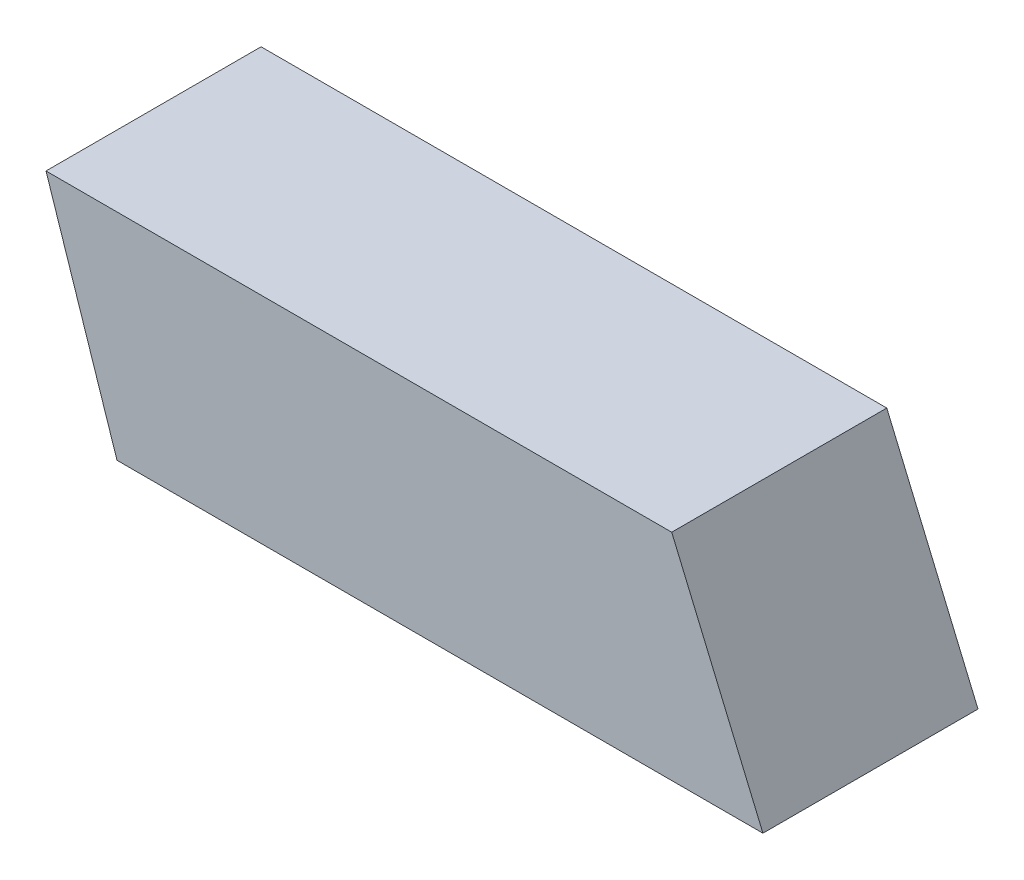
ISO-10303-21;
HEADER;
FILE_DESCRIPTION(('STEP AP214'),'2;1');
FILE_NAME('part.step','',(''),(''),'','','');
FILE_SCHEMA(('AUTOMOTIVE_DESIGN { 1 0 10303 214 1 1 1 1 }'));
ENDSEC;
DATA;
#1=APPLICATION_CONTEXT('core data for automotive mechanical design processes');
#2=APPLICATION_PROTOCOL_DEFINITION('international standard','automotive_design',2000,#1);
#3=PRODUCT_CONTEXT('',#1,'mechanical');
#4=PRODUCT('Part','Part','',(#3));
#5=PRODUCT_RELATED_PRODUCT_CATEGORY('part','',(#4));
#6=PRODUCT_DEFINITION_FORMATION('','',#4);
#7=PRODUCT_DEFINITION_CONTEXT('part definition',#1,'design');
#8=PRODUCT_DEFINITION('design','',#6,#7);
#9=PRODUCT_DEFINITION_SHAPE('','',#8);
#10=(LENGTH_UNIT() NAMED_UNIT(*) SI_UNIT(.MILLI.,.METRE.));
#11=(NAMED_UNIT(*) PLANE_ANGLE_UNIT() SI_UNIT($,.RADIAN.));
#12=(NAMED_UNIT(*) SI_UNIT($,.STERADIAN.) SOLID_ANGLE_UNIT());
#13=UNCERTAINTY_MEASURE_WITH_UNIT(LENGTH_MEASURE(1.E-05),#10,'distance_accuracy_value','');
#14=(GEOMETRIC_REPRESENTATION_CONTEXT(3) GLOBAL_UNCERTAINTY_ASSIGNED_CONTEXT((#13)) GLOBAL_UNIT_ASSIGNED_CONTEXT((#10,
#11,#12)) REPRESENTATION_CONTEXT('',''));
#15=CARTESIAN_POINT('',(0.,0.,0.));
#16=DIRECTION('',(0.,0.,1.));
#17=DIRECTION('',(1.,0.,0.));
#18=AXIS2_PLACEMENT_3D('',#15,#16,#17);
#19=CARTESIAN_POINT('',(20.,3.,-3.));
#20=DIRECTION('',(0.,0.,1.));
#21=DIRECTION('',(0.,-1.,0.));
#22=AXIS2_PLACEMENT_3D('',#19,#20,#21);
#23=PLANE('',#22);
#24=DIRECTION('',(-1.,0.,0.));
#25=VECTOR('',#24,1.);
#26=CARTESIAN_POINT('',(20.,-3.,-3.));
#27=LINE('',#26,#25);
#28=CARTESIAN_POINT('',(20.,-3.,-3.));
#29=VERTEX_POINT('',#28);
#30=CARTESIAN_POINT('',(1.98077745183307,-3.,-3.));
#31=VERTEX_POINT('',#30);
#32=EDGE_CURVE('E94',#29,#31,#27,.T.);
#33=ORIENTED_EDGE('',*,*,#32,.T.);
#34=DIRECTION('',(-0.313488412184445,0.949592025780585,0.));
#35=VECTOR('',#34,1.);
#36=CARTESIAN_POINT('',(1.96549969147849,-2.95372192769933,-3.));
#37=LINE('',#36,#35);
#38=CARTESIAN_POINT('',(0.,3.,-3.));
#39=VERTEX_POINT('',#38);
#40=EDGE_CURVE('E78',#31,#39,#37,.T.);
#41=ORIENTED_EDGE('',*,*,#40,.T.);
#42=DIRECTION('',(-1.,0.,0.));
#43=VECTOR('',#42,1.);
#44=CARTESIAN_POINT('',(20.,3.,-3.));
#45=LINE('',#44,#43);
#46=CARTESIAN_POINT('',(17.4553709627489,3.,-3.));
#47=VERTEX_POINT('',#46);
#48=EDGE_CURVE('E11',#47,#39,#45,.T.);
#49=ORIENTED_EDGE('',*,*,#48,.F.);
#50=DIRECTION('',(0.390442499959561,-0.920627315598081,0.));
#51=VECTOR('',#50,1.);
#52=CARTESIAN_POINT('',(17.843287816201,2.08532792535197,-3.));
#53=LINE('',#52,#51);
#54=EDGE_CURVE('E100',#47,#29,#53,.T.);
#55=ORIENTED_EDGE('',*,*,#54,.T.);
#56=EDGE_LOOP('',(#33,#41,#49,#55));
#57=FACE_BOUND('',#56,.T.);
#58=ADVANCED_FACE('F37',(#57),#23,.F.);
#59=CARTESIAN_POINT('',(20.,3.,3.));
#60=DIRECTION('',(0.,-1.,0.));
#61=DIRECTION('',(0.,0.,-1.));
#62=AXIS2_PLACEMENT_3D('',#59,#60,#61);
#63=PLANE('',#62);
#64=DIRECTION('',(-1.,0.,0.));
#65=VECTOR('',#64,1.);
#66=CARTESIAN_POINT('',(20.,3.,3.));
#67=LINE('',#66,#65);
#68=CARTESIAN_POINT('',(17.4553709627489,3.,3.));
#69=VERTEX_POINT('',#68);
#70=CARTESIAN_POINT('',(0.,3.,3.));
#71=VERTEX_POINT('',#70);
#72=EDGE_CURVE('E45',#69,#71,#67,.T.);
#73=ORIENTED_EDGE('',*,*,#72,.F.);
#74=DIRECTION('',(0.,0.,1.));
#75=VECTOR('',#74,1.);
#76=CARTESIAN_POINT('',(17.4553709627489,3.,-7.));
#77=LINE('',#76,#75);
#78=EDGE_CURVE('E90',#47,#69,#77,.T.);
#79=ORIENTED_EDGE('',*,*,#78,.F.);
#80=ORIENTED_EDGE('',*,*,#48,.T.);
#81=DIRECTION('',(0.,0.,1.));
#82=VECTOR('',#81,1.);
#83=CARTESIAN_POINT('',(0.,3.,3.));
#84=LINE('',#83,#82);
#85=EDGE_CURVE('E98',#39,#71,#84,.T.);
#86=ORIENTED_EDGE('',*,*,#85,.T.);
#87=EDGE_LOOP('',(#73,#79,#80,#86));
#88=FACE_BOUND('',#87,.T.);
#89=ADVANCED_FACE('F110',(#88),#63,.F.);
#90=CARTESIAN_POINT('',(20.,3.,3.));
#91=DIRECTION('',(0.,0.,-1.));
#92=DIRECTION('',(0.,1.,0.));
#93=AXIS2_PLACEMENT_3D('',#90,#91,#92);
#94=PLANE('',#93);
#95=ORIENTED_EDGE('',*,*,#72,.T.);
#96=DIRECTION('',(-0.313488412184445,0.949592025780585,0.));
#97=VECTOR('',#96,1.);
#98=CARTESIAN_POINT('',(0.,3.,3.));
#99=LINE('',#98,#97);
#100=CARTESIAN_POINT('',(1.98077745183307,-3.,3.));
#101=VERTEX_POINT('',#100);
#102=EDGE_CURVE('E75',#101,#71,#99,.T.);
#103=ORIENTED_EDGE('',*,*,#102,.F.);
#104=DIRECTION('',(-1.,0.,0.));
#105=VECTOR('',#104,1.);
#106=CARTESIAN_POINT('',(20.,-3.,3.));
#107=LINE('',#106,#105);
#108=CARTESIAN_POINT('',(20.,-3.,3.));
#109=VERTEX_POINT('',#108);
#110=EDGE_CURVE('E86',#109,#101,#107,.T.);
#111=ORIENTED_EDGE('',*,*,#110,.F.);
#112=DIRECTION('',(0.390442499959561,-0.920627315598081,0.));
#113=VECTOR('',#112,1.);
#114=CARTESIAN_POINT('',(17.4553709627489,3.,3.));
#115=LINE('',#114,#113);
#116=EDGE_CURVE('E51',#69,#109,#115,.T.);
#117=ORIENTED_EDGE('',*,*,#116,.F.);
#118=EDGE_LOOP('',(#95,#103,#111,#117));
#119=FACE_BOUND('',#118,.T.);
#120=ADVANCED_FACE('F85',(#119),#94,.F.);
#121=CARTESIAN_POINT('',(20.,-3.,3.));
#122=DIRECTION('',(0.,1.,0.));
#123=DIRECTION('',(0.,0.,1.));
#124=AXIS2_PLACEMENT_3D('',#121,#122,#123);
#125=PLANE('',#124);
#126=ORIENTED_EDGE('',*,*,#110,.T.);
#127=DIRECTION('',(0.,0.,1.));
#128=VECTOR('',#127,1.);
#129=CARTESIAN_POINT('',(1.98077745183307,-3.,-7.));
#130=LINE('',#129,#128);
#131=EDGE_CURVE('E72',#31,#101,#130,.T.);
#132=ORIENTED_EDGE('',*,*,#131,.F.);
#133=ORIENTED_EDGE('',*,*,#32,.F.);
#134=DIRECTION('',(0.,0.,-1.));
#135=VECTOR('',#134,1.);
#136=CARTESIAN_POINT('',(20.,-3.,3.));
#137=LINE('',#136,#135);
#138=EDGE_CURVE('E93',#109,#29,#137,.T.);
#139=ORIENTED_EDGE('',*,*,#138,.F.);
#140=EDGE_LOOP('',(#126,#132,#133,#139));
#141=FACE_BOUND('',#140,.T.);
#142=ADVANCED_FACE('F92',(#141),#125,.F.);
#143=CARTESIAN_POINT('',(0.,3.,-7.));
#144=DIRECTION('',(0.949592025780585,0.313488412184445,0.));
#145=DIRECTION('',(-0.313488412184445,0.949592025780585,0.));
#146=AXIS2_PLACEMENT_3D('',#143,#144,#145);
#147=PLANE('',#146);
#148=ORIENTED_EDGE('',*,*,#131,.T.);
#149=ORIENTED_EDGE('',*,*,#102,.T.);
#150=ORIENTED_EDGE('',*,*,#85,.F.);
#151=ORIENTED_EDGE('',*,*,#40,.F.);
#152=EDGE_LOOP('',(#148,#149,#150,#151));
#153=FACE_BOUND('',#152,.T.);
#154=ADVANCED_FACE('F74',(#153),#147,.F.);
#155=CARTESIAN_POINT('',(17.4553709627489,3.,-7.));
#156=DIRECTION('',(-0.920627315598081,-0.390442499959561,0.));
#157=DIRECTION('',(0.390442499959561,-0.920627315598081,0.));
#158=AXIS2_PLACEMENT_3D('',#155,#156,#157);
#159=PLANE('',#158);
#160=ORIENTED_EDGE('',*,*,#78,.T.);
#161=ORIENTED_EDGE('',*,*,#116,.T.);
#162=ORIENTED_EDGE('',*,*,#138,.T.);
#163=ORIENTED_EDGE('',*,*,#54,.F.);
#164=EDGE_LOOP('',(#160,#161,#162,#163));
#165=FACE_BOUND('',#164,.T.);
#166=ADVANCED_FACE('F107',(#165),#159,.F.);
#167=CLOSED_SHELL('',(#58,#89,#120,#142,#154,#166));
#168=MANIFOLD_SOLID_BREP('B2',#167);
#169=ADVANCED_BREP_SHAPE_REPRESENTATION('',(#18,#168),#14);
#170=SHAPE_DEFINITION_REPRESENTATION(#9,#169);
ENDSEC;
END-ISO-10303-21;
